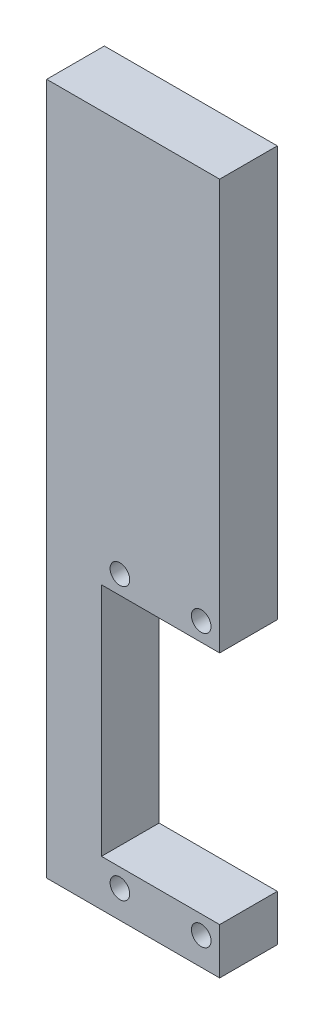
ISO-10303-21;
HEADER;
FILE_DESCRIPTION(('STEP AP214'),'2;1');
FILE_NAME('part.step','',(''),(''),'','','');
FILE_SCHEMA(('AUTOMOTIVE_DESIGN { 1 0 10303 214 1 1 1 1 }'));
ENDSEC;
DATA;
#1=APPLICATION_CONTEXT('core data for automotive mechanical design processes');
#2=APPLICATION_PROTOCOL_DEFINITION('international standard','automotive_design',2000,#1);
#3=PRODUCT_CONTEXT('',#1,'mechanical');
#4=PRODUCT('Part','Part','',(#3));
#5=PRODUCT_RELATED_PRODUCT_CATEGORY('part','',(#4));
#6=PRODUCT_DEFINITION_FORMATION('','',#4);
#7=PRODUCT_DEFINITION_CONTEXT('part definition',#1,'design');
#8=PRODUCT_DEFINITION('design','',#6,#7);
#9=PRODUCT_DEFINITION_SHAPE('','',#8);
#10=(LENGTH_UNIT() NAMED_UNIT(*) SI_UNIT(.MILLI.,.METRE.));
#11=(NAMED_UNIT(*) PLANE_ANGLE_UNIT() SI_UNIT($,.RADIAN.));
#12=(NAMED_UNIT(*) SI_UNIT($,.STERADIAN.) SOLID_ANGLE_UNIT());
#13=UNCERTAINTY_MEASURE_WITH_UNIT(LENGTH_MEASURE(1.E-05),#10,'distance_accuracy_value','');
#14=(GEOMETRIC_REPRESENTATION_CONTEXT(3) GLOBAL_UNCERTAINTY_ASSIGNED_CONTEXT((#13)) GLOBAL_UNIT_ASSIGNED_CONTEXT((#10,
#11,#12)) REPRESENTATION_CONTEXT('',''));
#15=CARTESIAN_POINT('',(0.,0.,0.));
#16=DIRECTION('',(0.,0.,1.));
#17=DIRECTION('',(1.,0.,0.));
#18=AXIS2_PLACEMENT_3D('',#15,#16,#17);
#19=CARTESIAN_POINT('',(-0.991735537190092,52.1900826446281,10.));
#20=DIRECTION('',(-1.,0.,0.));
#21=DIRECTION('',(0.,-1.,0.));
#22=AXIS2_PLACEMENT_3D('',#19,#20,#21);
#23=PLANE('',#22);
#24=DIRECTION('',(0.,1.,0.));
#25=VECTOR('',#24,1.);
#26=CARTESIAN_POINT('',(-0.991735537190092,52.1900826446281,0.));
#27=LINE('',#26,#25);
#28=CARTESIAN_POINT('',(-0.991735537190078,-67.8099173553719,0.));
#29=VERTEX_POINT('',#28);
#30=CARTESIAN_POINT('',(-0.991735537190078,-59.7862092815298,0.));
#31=VERTEX_POINT('',#30);
#32=EDGE_CURVE('E145',#29,#31,#27,.T.);
#33=ORIENTED_EDGE('',*,*,#32,.T.);
#34=DIRECTION('',(0.,0.,-1.));
#35=VECTOR('',#34,1.);
#36=CARTESIAN_POINT('',(-0.991735537190078,-59.7862092815298,10.));
#37=LINE('',#36,#35);
#38=CARTESIAN_POINT('',(-0.991735537190078,-59.7862092815298,10.));
#39=VERTEX_POINT('',#38);
#40=EDGE_CURVE('E139',#39,#31,#37,.T.);
#41=ORIENTED_EDGE('',*,*,#40,.F.);
#42=DIRECTION('',(0.,1.,0.));
#43=VECTOR('',#42,1.);
#44=CARTESIAN_POINT('',(-0.991735537190092,52.1900826446281,10.));
#45=LINE('',#44,#43);
#46=CARTESIAN_POINT('',(-0.991735537190078,-67.8099173553719,10.));
#47=VERTEX_POINT('',#46);
#48=EDGE_CURVE('E170',#47,#39,#45,.T.);
#49=ORIENTED_EDGE('',*,*,#48,.F.);
#50=DIRECTION('',(0.,0.,-1.));
#51=VECTOR('',#50,1.);
#52=CARTESIAN_POINT('',(-0.991735537190078,-67.8099173553719,10.));
#53=LINE('',#52,#51);
#54=EDGE_CURVE('E54',#47,#29,#53,.T.);
#55=ORIENTED_EDGE('',*,*,#54,.T.);
#56=EDGE_LOOP('',(#33,#41,#49,#55));
#57=FACE_BOUND('',#56,.T.);
#58=ADVANCED_FACE('F45',(#57),#23,.F.);
#59=CARTESIAN_POINT('',(0.,0.,10.));
#60=DIRECTION('',(0.,0.,1.));
#61=DIRECTION('',(1.,0.,0.));
#62=AXIS2_PLACEMENT_3D('',#59,#60,#61);
#63=PLANE('',#62);
#64=CARTESIAN_POINT('',(-18.2917355371901,-62.9862092815298,10.));
#65=DIRECTION('',(0.,0.,1.));
#66=DIRECTION('',(1.,0.,0.));
#67=AXIS2_PLACEMENT_3D('',#64,#65,#66);
#68=CIRCLE('',#67,1.7);
#69=CARTESIAN_POINT('',(-16.5917355371901,-62.9862092815298,10.));
#70=VERTEX_POINT('',#69);
#71=EDGE_CURVE('E205',#70,#70,#68,.T.);
#72=ORIENTED_EDGE('',*,*,#71,.F.);
#73=EDGE_LOOP('',(#72));
#74=FACE_BOUND('',#73,.T.);
#75=CARTESIAN_POINT('',(-18.2917355371901,-15.7862092815298,10.));
#76=DIRECTION('',(0.,0.,-1.));
#77=DIRECTION('',(-1.,0.,0.));
#78=AXIS2_PLACEMENT_3D('',#75,#76,#77);
#79=CIRCLE('',#78,1.7);
#80=CARTESIAN_POINT('',(-19.9917355371901,-15.7862092815298,10.));
#81=VERTEX_POINT('',#80);
#82=EDGE_CURVE('E196',#81,#81,#79,.T.);
#83=ORIENTED_EDGE('',*,*,#82,.T.);
#84=EDGE_LOOP('',(#83));
#85=FACE_BOUND('',#84,.T.);
#86=CARTESIAN_POINT('',(-4.19173553719008,-62.9862092815298,10.));
#87=DIRECTION('',(0.,0.,1.));
#88=DIRECTION('',(1.,0.,0.));
#89=AXIS2_PLACEMENT_3D('',#86,#87,#88);
#90=CIRCLE('',#89,1.7);
#91=CARTESIAN_POINT('',(-2.49173553719008,-62.9862092815298,10.));
#92=VERTEX_POINT('',#91);
#93=EDGE_CURVE('E216',#92,#92,#90,.T.);
#94=ORIENTED_EDGE('',*,*,#93,.F.);
#95=EDGE_LOOP('',(#94));
#96=FACE_BOUND('',#95,.T.);
#97=DIRECTION('',(-1.,0.,0.));
#98=VECTOR('',#97,1.);
#99=CARTESIAN_POINT('',(-0.991735537190078,-59.7862092815298,10.));
#100=LINE('',#99,#98);
#101=CARTESIAN_POINT('',(-21.4917355371901,-59.7862092815298,10.));
#102=VERTEX_POINT('',#101);
#103=EDGE_CURVE('E185',#39,#102,#100,.T.);
#104=ORIENTED_EDGE('',*,*,#103,.T.);
#105=DIRECTION('',(0.,-1.,0.));
#106=VECTOR('',#105,1.);
#107=CARTESIAN_POINT('',(-21.4917355371901,-18.9862092815298,10.));
#108=LINE('',#107,#106);
#109=CARTESIAN_POINT('',(-21.4917355371901,-18.9862092815298,10.));
#110=VERTEX_POINT('',#109);
#111=EDGE_CURVE('E130',#110,#102,#108,.T.);
#112=ORIENTED_EDGE('',*,*,#111,.F.);
#113=DIRECTION('',(1.,0.,0.));
#114=VECTOR('',#113,1.);
#115=CARTESIAN_POINT('',(-21.4917355371901,-18.9862092815298,10.));
#116=LINE('',#115,#114);
#117=CARTESIAN_POINT('',(-0.991735537190078,-18.9862092815298,10.));
#118=VERTEX_POINT('',#117);
#119=EDGE_CURVE('E182',#110,#118,#116,.T.);
#120=ORIENTED_EDGE('',*,*,#119,.T.);
#121=CARTESIAN_POINT('',(-0.991735537190092,52.1900826446281,10.));
#122=VERTEX_POINT('',#121);
#123=EDGE_CURVE('E137',#118,#122,#45,.T.);
#124=ORIENTED_EDGE('',*,*,#123,.T.);
#125=DIRECTION('',(-1.,0.,0.));
#126=VECTOR('',#125,1.);
#127=CARTESIAN_POINT('',(-30.9917355371901,52.1900826446281,10.));
#128=LINE('',#127,#126);
#129=CARTESIAN_POINT('',(-30.9917355371901,52.1900826446281,10.));
#130=VERTEX_POINT('',#129);
#131=EDGE_CURVE('E70',#122,#130,#128,.T.);
#132=ORIENTED_EDGE('',*,*,#131,.T.);
#133=DIRECTION('',(0.,-1.,0.));
#134=VECTOR('',#133,1.);
#135=CARTESIAN_POINT('',(-30.9917355371901,52.1900826446281,10.));
#136=LINE('',#135,#134);
#137=CARTESIAN_POINT('',(-30.9917355371901,-67.8099173553719,10.));
#138=VERTEX_POINT('',#137);
#139=EDGE_CURVE('E157',#130,#138,#136,.T.);
#140=ORIENTED_EDGE('',*,*,#139,.T.);
#141=DIRECTION('',(1.,0.,0.));
#142=VECTOR('',#141,1.);
#143=CARTESIAN_POINT('',(-30.9917355371901,-67.8099173553719,10.));
#144=LINE('',#143,#142);
#145=EDGE_CURVE('E98',#138,#47,#144,.T.);
#146=ORIENTED_EDGE('',*,*,#145,.T.);
#147=ORIENTED_EDGE('',*,*,#48,.T.);
#148=EDGE_LOOP('',(#104,#112,#120,#124,#132,#140,#146,#147));
#149=FACE_BOUND('',#148,.T.);
#150=CARTESIAN_POINT('',(-4.19173553719008,-15.7862092815298,10.));
#151=DIRECTION('',(0.,0.,-1.));
#152=DIRECTION('',(-1.,0.,0.));
#153=AXIS2_PLACEMENT_3D('',#150,#151,#152);
#154=CIRCLE('',#153,1.7);
#155=CARTESIAN_POINT('',(-5.89173553719008,-15.7862092815298,10.));
#156=VERTEX_POINT('',#155);
#157=EDGE_CURVE('E178',#156,#156,#154,.T.);
#158=ORIENTED_EDGE('',*,*,#157,.T.);
#159=EDGE_LOOP('',(#158));
#160=FACE_BOUND('',#159,.T.);
#161=ADVANCED_FACE('F251',(#74,#85,#96,#149,#160),#63,.T.);
#162=CARTESIAN_POINT('',(0.,0.,0.));
#163=DIRECTION('',(0.,0.,1.));
#164=DIRECTION('',(1.,0.,0.));
#165=AXIS2_PLACEMENT_3D('',#162,#163,#164);
#166=PLANE('',#165);
#167=CARTESIAN_POINT('',(-18.2917355371901,-62.9862092815298,0.));
#168=DIRECTION('',(0.,0.,1.));
#169=DIRECTION('',(1.,0.,0.));
#170=AXIS2_PLACEMENT_3D('',#167,#168,#169);
#171=CIRCLE('',#170,1.7);
#172=CARTESIAN_POINT('',(-16.5917355371901,-62.9862092815298,0.));
#173=VERTEX_POINT('',#172);
#174=EDGE_CURVE('E200',#173,#173,#171,.T.);
#175=ORIENTED_EDGE('',*,*,#174,.T.);
#176=EDGE_LOOP('',(#175));
#177=FACE_BOUND('',#176,.T.);
#178=DIRECTION('',(0.,-1.,0.));
#179=VECTOR('',#178,1.);
#180=CARTESIAN_POINT('',(-21.4917355371901,-18.9862092815298,0.));
#181=LINE('',#180,#179);
#182=CARTESIAN_POINT('',(-21.4917355371901,-18.9862092815298,0.));
#183=VERTEX_POINT('',#182);
#184=CARTESIAN_POINT('',(-21.4917355371901,-59.7862092815298,0.));
#185=VERTEX_POINT('',#184);
#186=EDGE_CURVE('E61',#183,#185,#181,.T.);
#187=ORIENTED_EDGE('',*,*,#186,.T.);
#188=DIRECTION('',(-1.,0.,0.));
#189=VECTOR('',#188,1.);
#190=CARTESIAN_POINT('',(-0.991735537190078,-59.7862092815298,0.));
#191=LINE('',#190,#189);
#192=EDGE_CURVE('E129',#31,#185,#191,.T.);
#193=ORIENTED_EDGE('',*,*,#192,.F.);
#194=ORIENTED_EDGE('',*,*,#32,.F.);
#195=DIRECTION('',(1.,0.,0.));
#196=VECTOR('',#195,1.);
#197=CARTESIAN_POINT('',(-30.9917355371901,-67.8099173553719,0.));
#198=LINE('',#197,#196);
#199=CARTESIAN_POINT('',(-30.9917355371901,-67.8099173553719,0.));
#200=VERTEX_POINT('',#199);
#201=EDGE_CURVE('E146',#200,#29,#198,.T.);
#202=ORIENTED_EDGE('',*,*,#201,.F.);
#203=DIRECTION('',(0.,-1.,0.));
#204=VECTOR('',#203,1.);
#205=CARTESIAN_POINT('',(-30.9917355371901,52.1900826446281,0.));
#206=LINE('',#205,#204);
#207=CARTESIAN_POINT('',(-30.9917355371901,52.1900826446281,0.));
#208=VERTEX_POINT('',#207);
#209=EDGE_CURVE('E151',#208,#200,#206,.T.);
#210=ORIENTED_EDGE('',*,*,#209,.F.);
#211=DIRECTION('',(-1.,0.,0.));
#212=VECTOR('',#211,1.);
#213=CARTESIAN_POINT('',(-30.9917355371901,52.1900826446281,0.));
#214=LINE('',#213,#212);
#215=CARTESIAN_POINT('',(-0.991735537190092,52.1900826446281,0.));
#216=VERTEX_POINT('',#215);
#217=EDGE_CURVE('E91',#216,#208,#214,.T.);
#218=ORIENTED_EDGE('',*,*,#217,.F.);
#219=CARTESIAN_POINT('',(-0.991735537190078,-18.9862092815298,0.));
#220=VERTEX_POINT('',#219);
#221=EDGE_CURVE('E136',#220,#216,#27,.T.);
#222=ORIENTED_EDGE('',*,*,#221,.F.);
#223=DIRECTION('',(1.,0.,0.));
#224=VECTOR('',#223,1.);
#225=CARTESIAN_POINT('',(-21.4917355371901,-18.9862092815298,0.));
#226=LINE('',#225,#224);
#227=EDGE_CURVE('E119',#183,#220,#226,.T.);
#228=ORIENTED_EDGE('',*,*,#227,.F.);
#229=EDGE_LOOP('',(#187,#193,#194,#202,#210,#218,#222,#228));
#230=FACE_BOUND('',#229,.T.);
#231=CARTESIAN_POINT('',(-18.2917355371901,-15.7862092815298,0.));
#232=DIRECTION('',(0.,0.,-1.));
#233=DIRECTION('',(-1.,0.,0.));
#234=AXIS2_PLACEMENT_3D('',#231,#232,#233);
#235=CIRCLE('',#234,1.7);
#236=CARTESIAN_POINT('',(-19.9917355371901,-15.7862092815298,0.));
#237=VERTEX_POINT('',#236);
#238=EDGE_CURVE('E191',#237,#237,#235,.T.);
#239=ORIENTED_EDGE('',*,*,#238,.F.);
#240=EDGE_LOOP('',(#239));
#241=FACE_BOUND('',#240,.T.);
#242=CARTESIAN_POINT('',(-4.19173553719008,-62.9862092815298,0.));
#243=DIRECTION('',(0.,0.,1.));
#244=DIRECTION('',(1.,0.,0.));
#245=AXIS2_PLACEMENT_3D('',#242,#243,#244);
#246=CIRCLE('',#245,1.7);
#247=CARTESIAN_POINT('',(-2.49173553719008,-62.9862092815298,0.));
#248=VERTEX_POINT('',#247);
#249=EDGE_CURVE('E204',#248,#248,#246,.T.);
#250=ORIENTED_EDGE('',*,*,#249,.T.);
#251=EDGE_LOOP('',(#250));
#252=FACE_BOUND('',#251,.T.);
#253=CARTESIAN_POINT('',(-4.19173553719008,-15.7862092815298,0.));
#254=DIRECTION('',(0.,0.,-1.));
#255=DIRECTION('',(-1.,0.,0.));
#256=AXIS2_PLACEMENT_3D('',#253,#254,#255);
#257=CIRCLE('',#256,1.7);
#258=CARTESIAN_POINT('',(-5.89173553719008,-15.7862092815298,0.));
#259=VERTEX_POINT('',#258);
#260=EDGE_CURVE('E209',#259,#259,#257,.T.);
#261=ORIENTED_EDGE('',*,*,#260,.F.);
#262=EDGE_LOOP('',(#261));
#263=FACE_BOUND('',#262,.T.);
#264=ADVANCED_FACE('F141',(#177,#230,#241,#252,#263),#166,.F.);
#265=CARTESIAN_POINT('',(-30.9917355371901,52.1900826446281,10.));
#266=DIRECTION('',(1.,0.,0.));
#267=DIRECTION('',(0.,0.,-1.));
#268=AXIS2_PLACEMENT_3D('',#265,#266,#267);
#269=PLANE('',#268);
#270=ORIENTED_EDGE('',*,*,#209,.T.);
#271=DIRECTION('',(0.,0.,-1.));
#272=VECTOR('',#271,1.);
#273=CARTESIAN_POINT('',(-30.9917355371901,-67.8099173553719,10.));
#274=LINE('',#273,#272);
#275=EDGE_CURVE('E11',#138,#200,#274,.T.);
#276=ORIENTED_EDGE('',*,*,#275,.F.);
#277=ORIENTED_EDGE('',*,*,#139,.F.);
#278=DIRECTION('',(0.,0.,-1.));
#279=VECTOR('',#278,1.);
#280=CARTESIAN_POINT('',(-30.9917355371901,52.1900826446281,10.));
#281=LINE('',#280,#279);
#282=EDGE_CURVE('E158',#130,#208,#281,.T.);
#283=ORIENTED_EDGE('',*,*,#282,.T.);
#284=EDGE_LOOP('',(#270,#276,#277,#283));
#285=FACE_BOUND('',#284,.T.);
#286=ADVANCED_FACE('F47',(#285),#269,.F.);
#287=CARTESIAN_POINT('',(-30.9917355371901,-67.8099173553719,10.));
#288=DIRECTION('',(0.,1.,0.));
#289=DIRECTION('',(0.,0.,1.));
#290=AXIS2_PLACEMENT_3D('',#287,#288,#289);
#291=PLANE('',#290);
#292=ORIENTED_EDGE('',*,*,#201,.T.);
#293=ORIENTED_EDGE('',*,*,#54,.F.);
#294=ORIENTED_EDGE('',*,*,#145,.F.);
#295=ORIENTED_EDGE('',*,*,#275,.T.);
#296=EDGE_LOOP('',(#292,#293,#294,#295));
#297=FACE_BOUND('',#296,.T.);
#298=ADVANCED_FACE('F248',(#297),#291,.F.);
#299=ORIENTED_EDGE('',*,*,#123,.F.);
#300=DIRECTION('',(0.,0.,-1.));
#301=VECTOR('',#300,1.);
#302=CARTESIAN_POINT('',(-0.991735537190078,-18.9862092815298,10.));
#303=LINE('',#302,#301);
#304=EDGE_CURVE('E123',#118,#220,#303,.T.);
#305=ORIENTED_EDGE('',*,*,#304,.T.);
#306=ORIENTED_EDGE('',*,*,#221,.T.);
#307=DIRECTION('',(0.,0.,-1.));
#308=VECTOR('',#307,1.);
#309=CARTESIAN_POINT('',(-0.991735537190092,52.1900826446281,10.));
#310=LINE('',#309,#308);
#311=EDGE_CURVE('E161',#122,#216,#310,.T.);
#312=ORIENTED_EDGE('',*,*,#311,.F.);
#313=EDGE_LOOP('',(#299,#305,#306,#312));
#314=FACE_BOUND('',#313,.T.);
#315=ADVANCED_FACE('F134',(#314),#23,.F.);
#316=CARTESIAN_POINT('',(-30.9917355371901,52.1900826446281,10.));
#317=DIRECTION('',(0.,-1.,0.));
#318=DIRECTION('',(0.,0.,-1.));
#319=AXIS2_PLACEMENT_3D('',#316,#317,#318);
#320=PLANE('',#319);
#321=ORIENTED_EDGE('',*,*,#217,.T.);
#322=ORIENTED_EDGE('',*,*,#282,.F.);
#323=ORIENTED_EDGE('',*,*,#131,.F.);
#324=ORIENTED_EDGE('',*,*,#311,.T.);
#325=EDGE_LOOP('',(#321,#322,#323,#324));
#326=FACE_BOUND('',#325,.T.);
#327=ADVANCED_FACE('F235',(#326),#320,.F.);
#328=CARTESIAN_POINT('',(-4.19173553719008,-62.9862092815298,10.));
#329=DIRECTION('',(0.,0.,-1.));
#330=DIRECTION('',(-1.,0.,0.));
#331=AXIS2_PLACEMENT_3D('',#328,#329,#330);
#332=CYLINDRICAL_SURFACE('',#331,1.7);
#333=ORIENTED_EDGE('',*,*,#93,.T.);
#334=EDGE_LOOP('',(#333));
#335=FACE_BOUND('',#334,.T.);
#336=ORIENTED_EDGE('',*,*,#249,.F.);
#337=EDGE_LOOP('',(#336));
#338=FACE_BOUND('',#337,.T.);
#339=ADVANCED_FACE('F237',(#335,#338),#332,.F.);
#340=CARTESIAN_POINT('',(-18.2917355371901,-15.7862092815298,10.));
#341=DIRECTION('',(0.,0.,-1.));
#342=DIRECTION('',(-1.,0.,0.));
#343=AXIS2_PLACEMENT_3D('',#340,#341,#342);
#344=CYLINDRICAL_SURFACE('',#343,1.7);
#345=ORIENTED_EDGE('',*,*,#82,.F.);
#346=EDGE_LOOP('',(#345));
#347=FACE_BOUND('',#346,.T.);
#348=ORIENTED_EDGE('',*,*,#238,.T.);
#349=EDGE_LOOP('',(#348));
#350=FACE_BOUND('',#349,.T.);
#351=ADVANCED_FACE('F244',(#347,#350),#344,.F.);
#352=CARTESIAN_POINT('',(-21.4917355371901,-18.9862092815298,10.));
#353=DIRECTION('',(1.,0.,0.));
#354=DIRECTION('',(0.,0.,-1.));
#355=AXIS2_PLACEMENT_3D('',#352,#353,#354);
#356=PLANE('',#355);
#357=ORIENTED_EDGE('',*,*,#186,.F.);
#358=DIRECTION('',(0.,0.,-1.));
#359=VECTOR('',#358,1.);
#360=CARTESIAN_POINT('',(-21.4917355371901,-18.9862092815298,10.));
#361=LINE('',#360,#359);
#362=EDGE_CURVE('E125',#110,#183,#361,.T.);
#363=ORIENTED_EDGE('',*,*,#362,.F.);
#364=ORIENTED_EDGE('',*,*,#111,.T.);
#365=DIRECTION('',(0.,0.,-1.));
#366=VECTOR('',#365,1.);
#367=CARTESIAN_POINT('',(-21.4917355371901,-59.7862092815298,10.));
#368=LINE('',#367,#366);
#369=EDGE_CURVE('E195',#102,#185,#368,.T.);
#370=ORIENTED_EDGE('',*,*,#369,.T.);
#371=EDGE_LOOP('',(#357,#363,#364,#370));
#372=FACE_BOUND('',#371,.T.);
#373=ADVANCED_FACE('F277',(#372),#356,.T.);
#374=CARTESIAN_POINT('',(-0.991735537190078,-59.7862092815298,10.));
#375=DIRECTION('',(0.,-1.,0.));
#376=DIRECTION('',(0.,0.,-1.));
#377=AXIS2_PLACEMENT_3D('',#374,#375,#376);
#378=PLANE('',#377);
#379=ORIENTED_EDGE('',*,*,#192,.T.);
#380=ORIENTED_EDGE('',*,*,#369,.F.);
#381=ORIENTED_EDGE('',*,*,#103,.F.);
#382=ORIENTED_EDGE('',*,*,#40,.T.);
#383=EDGE_LOOP('',(#379,#380,#381,#382));
#384=FACE_BOUND('',#383,.T.);
#385=ADVANCED_FACE('F281',(#384),#378,.F.);
#386=CARTESIAN_POINT('',(-21.4917355371901,-18.9862092815298,10.));
#387=DIRECTION('',(0.,1.,0.));
#388=DIRECTION('',(-1.,0.,0.));
#389=AXIS2_PLACEMENT_3D('',#386,#387,#388);
#390=PLANE('',#389);
#391=ORIENTED_EDGE('',*,*,#227,.T.);
#392=ORIENTED_EDGE('',*,*,#304,.F.);
#393=ORIENTED_EDGE('',*,*,#119,.F.);
#394=ORIENTED_EDGE('',*,*,#362,.T.);
#395=EDGE_LOOP('',(#391,#392,#393,#394));
#396=FACE_BOUND('',#395,.T.);
#397=ADVANCED_FACE('F121',(#396),#390,.F.);
#398=CARTESIAN_POINT('',(-4.19173553719008,-15.7862092815298,10.));
#399=DIRECTION('',(0.,0.,-1.));
#400=DIRECTION('',(-1.,0.,0.));
#401=AXIS2_PLACEMENT_3D('',#398,#399,#400);
#402=CYLINDRICAL_SURFACE('',#401,1.7);
#403=ORIENTED_EDGE('',*,*,#157,.F.);
#404=EDGE_LOOP('',(#403));
#405=FACE_BOUND('',#404,.T.);
#406=ORIENTED_EDGE('',*,*,#260,.T.);
#407=EDGE_LOOP('',(#406));
#408=FACE_BOUND('',#407,.T.);
#409=ADVANCED_FACE('F267',(#405,#408),#402,.F.);
#410=CARTESIAN_POINT('',(-18.2917355371901,-62.9862092815298,10.));
#411=DIRECTION('',(0.,0.,-1.));
#412=DIRECTION('',(-1.,0.,0.));
#413=AXIS2_PLACEMENT_3D('',#410,#411,#412);
#414=CYLINDRICAL_SURFACE('',#413,1.7);
#415=ORIENTED_EDGE('',*,*,#71,.T.);
#416=EDGE_LOOP('',(#415));
#417=FACE_BOUND('',#416,.T.);
#418=ORIENTED_EDGE('',*,*,#174,.F.);
#419=EDGE_LOOP('',(#418));
#420=FACE_BOUND('',#419,.T.);
#421=ADVANCED_FACE('F270',(#417,#420),#414,.F.);
#422=CLOSED_SHELL('',(#58,#161,#264,#286,#298,#315,#327,#339,#351,#373,#385,#397,#409,#421));
#423=MANIFOLD_SOLID_BREP('B2',#422);
#424=ADVANCED_BREP_SHAPE_REPRESENTATION('',(#18,#423),#14);
#425=SHAPE_DEFINITION_REPRESENTATION(#9,#424);
ENDSEC;
END-ISO-10303-21;
